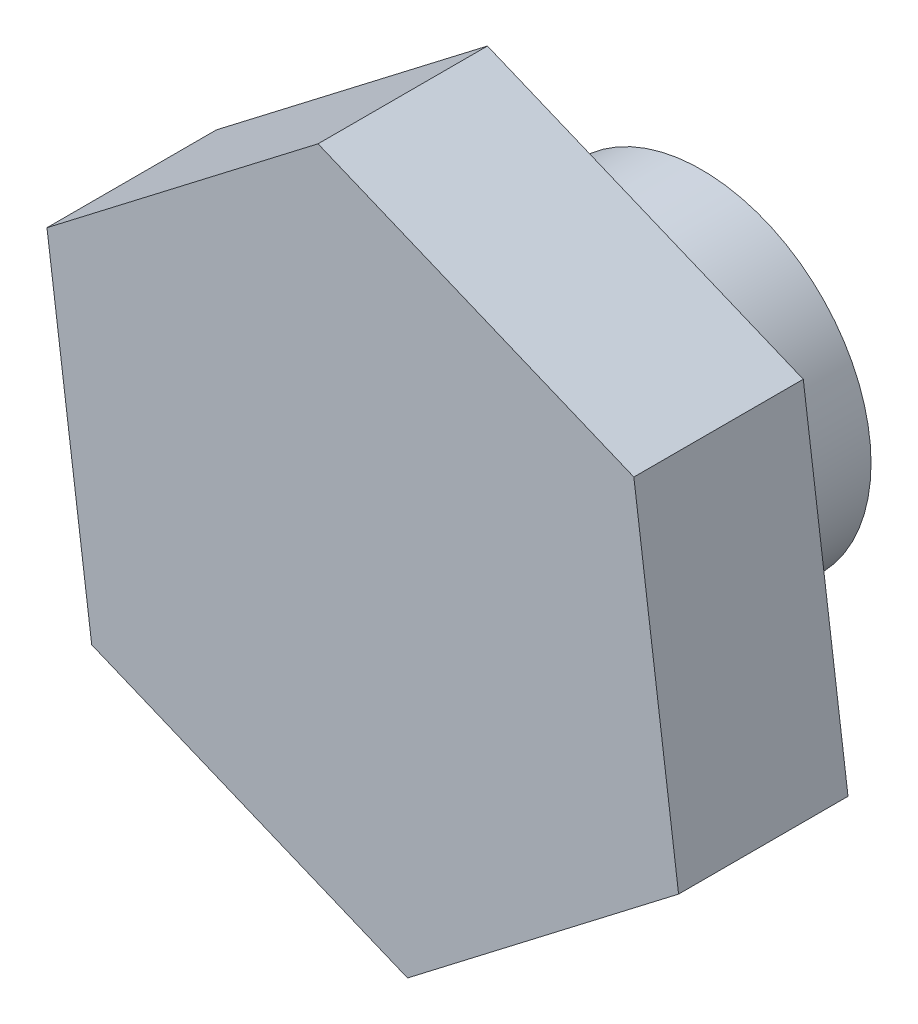
ISO-10303-21;
HEADER;
FILE_DESCRIPTION(('STEP AP214'),'2;1');
FILE_NAME('part.step','',(''),(''),'','','');
FILE_SCHEMA(('AUTOMOTIVE_DESIGN { 1 0 10303 214 1 1 1 1 }'));
ENDSEC;
DATA;
#1=APPLICATION_CONTEXT('core data for automotive mechanical design processes');
#2=APPLICATION_PROTOCOL_DEFINITION('international standard','automotive_design',2000,#1);
#3=PRODUCT_CONTEXT('',#1,'mechanical');
#4=PRODUCT('Part','Part','',(#3));
#5=PRODUCT_RELATED_PRODUCT_CATEGORY('part','',(#4));
#6=PRODUCT_DEFINITION_FORMATION('','',#4);
#7=PRODUCT_DEFINITION_CONTEXT('part definition',#1,'design');
#8=PRODUCT_DEFINITION('design','',#6,#7);
#9=PRODUCT_DEFINITION_SHAPE('','',#8);
#10=(LENGTH_UNIT() NAMED_UNIT(*) SI_UNIT(.MILLI.,.METRE.));
#11=(NAMED_UNIT(*) PLANE_ANGLE_UNIT() SI_UNIT($,.RADIAN.));
#12=(NAMED_UNIT(*) SI_UNIT($,.STERADIAN.) SOLID_ANGLE_UNIT());
#13=UNCERTAINTY_MEASURE_WITH_UNIT(LENGTH_MEASURE(1.E-05),#10,'distance_accuracy_value','');
#14=(GEOMETRIC_REPRESENTATION_CONTEXT(3) GLOBAL_UNCERTAINTY_ASSIGNED_CONTEXT((#13)) GLOBAL_UNIT_ASSIGNED_CONTEXT((#10,
#11,#12)) REPRESENTATION_CONTEXT('',''));
#15=CARTESIAN_POINT('',(0.,0.,0.));
#16=DIRECTION('',(0.,0.,1.));
#17=DIRECTION('',(1.,0.,0.));
#18=AXIS2_PLACEMENT_3D('',#15,#16,#17);
#19=CARTESIAN_POINT('',(-6.60254037844389,50.,25.));
#20=DIRECTION('',(0.609071983146348,-0.793114947120639,0.));
#21=DIRECTION('',(0.793114947120639,0.609071983146348,0.));
#22=AXIS2_PLACEMENT_3D('',#19,#20,#21);
#23=PLANE('',#22);
#24=DIRECTION('',(-0.793114947120639,-0.609071983146348,0.));
#25=VECTOR('',#24,1.);
#26=CARTESIAN_POINT('',(-6.60254037844389,50.,0.));
#27=LINE('',#26,#25);
#28=CARTESIAN_POINT('',(-6.60254037844389,50.,0.));
#29=VERTEX_POINT('',#28);
#30=CARTESIAN_POINT('',(-46.6025403784439,19.2820323027551,0.));
#31=VERTEX_POINT('',#30);
#32=EDGE_CURVE('E124',#29,#31,#27,.T.);
#33=ORIENTED_EDGE('',*,*,#32,.T.);
#34=DIRECTION('',(0.,0.,-1.));
#35=VECTOR('',#34,1.);
#36=CARTESIAN_POINT('',(-46.6025403784439,19.2820323027551,25.));
#37=LINE('',#36,#35);
#38=CARTESIAN_POINT('',(-46.6025403784439,19.2820323027551,25.));
#39=VERTEX_POINT('',#38);
#40=EDGE_CURVE('E47',#39,#31,#37,.T.);
#41=ORIENTED_EDGE('',*,*,#40,.F.);
#42=DIRECTION('',(-0.793114947120639,-0.609071983146348,0.));
#43=VECTOR('',#42,1.);
#44=CARTESIAN_POINT('',(-6.60254037844389,50.,25.));
#45=LINE('',#44,#43);
#46=CARTESIAN_POINT('',(-6.60254037844389,50.,25.));
#47=VERTEX_POINT('',#46);
#48=EDGE_CURVE('E135',#47,#39,#45,.T.);
#49=ORIENTED_EDGE('',*,*,#48,.F.);
#50=DIRECTION('',(0.,0.,-1.));
#51=VECTOR('',#50,1.);
#52=CARTESIAN_POINT('',(-6.60254037844389,50.,25.));
#53=LINE('',#52,#51);
#54=EDGE_CURVE('E120',#47,#29,#53,.T.);
#55=ORIENTED_EDGE('',*,*,#54,.T.);
#56=EDGE_LOOP('',(#33,#41,#49,#55));
#57=FACE_BOUND('',#56,.T.);
#58=ADVANCED_FACE('F39',(#57),#23,.F.);
#59=CARTESIAN_POINT('',(-46.6025403784439,19.2820323027551,25.));
#60=DIRECTION('',(0.9913936839008,0.130914336577785,0.));
#61=DIRECTION('',(-0.130914336577785,0.9913936839008,0.));
#62=AXIS2_PLACEMENT_3D('',#59,#60,#61);
#63=PLANE('',#62);
#64=DIRECTION('',(0.130914336577785,-0.9913936839008,0.));
#65=VECTOR('',#64,1.);
#66=CARTESIAN_POINT('',(-46.6025403784439,19.2820323027551,0.));
#67=LINE('',#66,#65);
#68=CARTESIAN_POINT('',(-40.,-30.7179676972449,0.));
#69=VERTEX_POINT('',#68);
#70=EDGE_CURVE('E127',#31,#69,#67,.T.);
#71=ORIENTED_EDGE('',*,*,#70,.T.);
#72=DIRECTION('',(0.,0.,-1.));
#73=VECTOR('',#72,1.);
#74=CARTESIAN_POINT('',(-40.,-30.7179676972449,25.));
#75=LINE('',#74,#73);
#76=CARTESIAN_POINT('',(-40.,-30.7179676972449,25.));
#77=VERTEX_POINT('',#76);
#78=EDGE_CURVE('E139',#77,#69,#75,.T.);
#79=ORIENTED_EDGE('',*,*,#78,.F.);
#80=DIRECTION('',(0.130914336577785,-0.9913936839008,0.));
#81=VECTOR('',#80,1.);
#82=CARTESIAN_POINT('',(-46.6025403784439,19.2820323027551,25.));
#83=LINE('',#82,#81);
#84=EDGE_CURVE('E93',#39,#77,#83,.T.);
#85=ORIENTED_EDGE('',*,*,#84,.F.);
#86=ORIENTED_EDGE('',*,*,#40,.T.);
#87=EDGE_LOOP('',(#71,#79,#85,#86));
#88=FACE_BOUND('',#87,.T.);
#89=ADVANCED_FACE('F142',(#88),#63,.F.);
#90=CARTESIAN_POINT('',(-40.,-30.7179676972449,25.));
#91=DIRECTION('',(0.382321700754451,0.924029283698425,0.));
#92=DIRECTION('',(-0.924029283698425,0.382321700754451,0.));
#93=AXIS2_PLACEMENT_3D('',#90,#91,#92);
#94=PLANE('',#93);
#95=DIRECTION('',(0.924029283698425,-0.382321700754451,0.));
#96=VECTOR('',#95,1.);
#97=CARTESIAN_POINT('',(-40.,-30.7179676972449,0.));
#98=LINE('',#97,#96);
#99=CARTESIAN_POINT('',(6.60254037844388,-50.,0.));
#100=VERTEX_POINT('',#99);
#101=EDGE_CURVE('E130',#69,#100,#98,.T.);
#102=ORIENTED_EDGE('',*,*,#101,.T.);
#103=DIRECTION('',(0.,0.,-1.));
#104=VECTOR('',#103,1.);
#105=CARTESIAN_POINT('',(6.60254037844388,-50.,25.));
#106=LINE('',#105,#104);
#107=CARTESIAN_POINT('',(6.60254037844388,-50.,25.));
#108=VERTEX_POINT('',#107);
#109=EDGE_CURVE('E115',#108,#100,#106,.T.);
#110=ORIENTED_EDGE('',*,*,#109,.F.);
#111=DIRECTION('',(0.924029283698425,-0.382321700754451,0.));
#112=VECTOR('',#111,1.);
#113=CARTESIAN_POINT('',(-40.,-30.7179676972449,25.));
#114=LINE('',#113,#112);
#115=EDGE_CURVE('E106',#77,#108,#114,.T.);
#116=ORIENTED_EDGE('',*,*,#115,.F.);
#117=ORIENTED_EDGE('',*,*,#78,.T.);
#118=EDGE_LOOP('',(#102,#110,#116,#117));
#119=FACE_BOUND('',#118,.T.);
#120=ADVANCED_FACE('F150',(#119),#94,.F.);
#121=CARTESIAN_POINT('',(6.60254037844388,-50.,25.));
#122=DIRECTION('',(-0.609071983146348,0.793114947120639,0.));
#123=DIRECTION('',(-0.79311494712064,-0.609071983146348,0.));
#124=AXIS2_PLACEMENT_3D('',#121,#122,#123);
#125=PLANE('',#124);
#126=DIRECTION('',(0.793114947120639,0.609071983146348,0.));
#127=VECTOR('',#126,1.);
#128=CARTESIAN_POINT('',(6.60254037844388,-50.,0.));
#129=LINE('',#128,#127);
#130=CARTESIAN_POINT('',(46.6025403784439,-19.2820323027551,0.));
#131=VERTEX_POINT('',#130);
#132=EDGE_CURVE('E114',#100,#131,#129,.T.);
#133=ORIENTED_EDGE('',*,*,#132,.T.);
#134=DIRECTION('',(0.,0.,-1.));
#135=VECTOR('',#134,1.);
#136=CARTESIAN_POINT('',(46.6025403784439,-19.2820323027551,25.));
#137=LINE('',#136,#135);
#138=CARTESIAN_POINT('',(46.6025403784439,-19.2820323027551,25.));
#139=VERTEX_POINT('',#138);
#140=EDGE_CURVE('E111',#139,#131,#137,.T.);
#141=ORIENTED_EDGE('',*,*,#140,.F.);
#142=DIRECTION('',(0.793114947120639,0.609071983146348,0.));
#143=VECTOR('',#142,1.);
#144=CARTESIAN_POINT('',(6.60254037844388,-50.,25.));
#145=LINE('',#144,#143);
#146=EDGE_CURVE('E100',#108,#139,#145,.T.);
#147=ORIENTED_EDGE('',*,*,#146,.F.);
#148=ORIENTED_EDGE('',*,*,#109,.T.);
#149=EDGE_LOOP('',(#133,#141,#147,#148));
#150=FACE_BOUND('',#149,.T.);
#151=ADVANCED_FACE('F112',(#150),#125,.F.);
#152=CARTESIAN_POINT('',(46.6025403784439,-19.2820323027551,25.));
#153=DIRECTION('',(-0.9913936839008,-0.130914336577785,0.));
#154=DIRECTION('',(0.130914336577785,-0.9913936839008,0.));
#155=AXIS2_PLACEMENT_3D('',#152,#153,#154);
#156=PLANE('',#155);
#157=DIRECTION('',(-0.130914336577785,0.9913936839008,0.));
#158=VECTOR('',#157,1.);
#159=CARTESIAN_POINT('',(46.6025403784439,-19.2820323027551,0.));
#160=LINE('',#159,#158);
#161=CARTESIAN_POINT('',(40.,30.7179676972449,0.));
#162=VERTEX_POINT('',#161);
#163=EDGE_CURVE('E78',#131,#162,#160,.T.);
#164=ORIENTED_EDGE('',*,*,#163,.T.);
#165=DIRECTION('',(0.,0.,-1.));
#166=VECTOR('',#165,1.);
#167=CARTESIAN_POINT('',(40.,30.7179676972449,25.));
#168=LINE('',#167,#166);
#169=CARTESIAN_POINT('',(40.,30.7179676972449,25.));
#170=VERTEX_POINT('',#169);
#171=EDGE_CURVE('E116',#170,#162,#168,.T.);
#172=ORIENTED_EDGE('',*,*,#171,.F.);
#173=DIRECTION('',(-0.130914336577785,0.9913936839008,0.));
#174=VECTOR('',#173,1.);
#175=CARTESIAN_POINT('',(46.6025403784439,-19.2820323027551,25.));
#176=LINE('',#175,#174);
#177=EDGE_CURVE('E104',#139,#170,#176,.T.);
#178=ORIENTED_EDGE('',*,*,#177,.F.);
#179=ORIENTED_EDGE('',*,*,#140,.T.);
#180=EDGE_LOOP('',(#164,#172,#178,#179));
#181=FACE_BOUND('',#180,.T.);
#182=ADVANCED_FACE('F118',(#181),#156,.F.);
#183=CARTESIAN_POINT('',(40.,30.7179676972449,25.));
#184=DIRECTION('',(-0.382321700754452,-0.924029283698425,0.));
#185=DIRECTION('',(0.924029283698425,-0.382321700754452,0.));
#186=AXIS2_PLACEMENT_3D('',#183,#184,#185);
#187=PLANE('',#186);
#188=DIRECTION('',(-0.924029283698425,0.382321700754451,0.));
#189=VECTOR('',#188,1.);
#190=CARTESIAN_POINT('',(40.,30.7179676972449,0.));
#191=LINE('',#190,#189);
#192=EDGE_CURVE('E84',#162,#29,#191,.T.);
#193=ORIENTED_EDGE('',*,*,#192,.T.);
#194=ORIENTED_EDGE('',*,*,#54,.F.);
#195=DIRECTION('',(-0.924029283698425,0.382321700754451,0.));
#196=VECTOR('',#195,1.);
#197=CARTESIAN_POINT('',(40.,30.7179676972449,25.));
#198=LINE('',#197,#196);
#199=EDGE_CURVE('E55',#170,#47,#198,.T.);
#200=ORIENTED_EDGE('',*,*,#199,.F.);
#201=ORIENTED_EDGE('',*,*,#171,.T.);
#202=EDGE_LOOP('',(#193,#194,#200,#201));
#203=FACE_BOUND('',#202,.T.);
#204=ADVANCED_FACE('F194',(#203),#187,.F.);
#205=CARTESIAN_POINT('',(0.,0.,25.));
#206=DIRECTION('',(0.,0.,1.));
#207=DIRECTION('',(1.,0.,0.));
#208=AXIS2_PLACEMENT_3D('',#205,#206,#207);
#209=PLANE('',#208);
#210=ORIENTED_EDGE('',*,*,#48,.T.);
#211=ORIENTED_EDGE('',*,*,#84,.T.);
#212=ORIENTED_EDGE('',*,*,#115,.T.);
#213=ORIENTED_EDGE('',*,*,#146,.T.);
#214=ORIENTED_EDGE('',*,*,#177,.T.);
#215=ORIENTED_EDGE('',*,*,#199,.T.);
#216=EDGE_LOOP('',(#210,#211,#212,#213,#214,#215));
#217=FACE_BOUND('',#216,.T.);
#218=ADVANCED_FACE('F102',(#217),#209,.T.);
#219=CARTESIAN_POINT('',(0.,0.,0.));
#220=DIRECTION('',(0.,0.,1.));
#221=DIRECTION('',(1.,0.,0.));
#222=AXIS2_PLACEMENT_3D('',#219,#220,#221);
#223=PLANE('',#222);
#224=CARTESIAN_POINT('',(0.,0.,0.));
#225=DIRECTION('',(0.,0.,1.));
#226=DIRECTION('',(1.,0.,0.));
#227=AXIS2_PLACEMENT_3D('',#224,#225,#226);
#228=CIRCLE('',#227,25.);
#229=CARTESIAN_POINT('',(25.,0.,0.));
#230=VERTEX_POINT('',#229);
#231=EDGE_CURVE('E154',#230,#230,#228,.T.);
#232=ORIENTED_EDGE('',*,*,#231,.T.);
#233=EDGE_LOOP('',(#232));
#234=FACE_BOUND('',#233,.T.);
#235=ORIENTED_EDGE('',*,*,#32,.F.);
#236=ORIENTED_EDGE('',*,*,#192,.F.);
#237=ORIENTED_EDGE('',*,*,#163,.F.);
#238=ORIENTED_EDGE('',*,*,#132,.F.);
#239=ORIENTED_EDGE('',*,*,#101,.F.);
#240=ORIENTED_EDGE('',*,*,#70,.F.);
#241=EDGE_LOOP('',(#235,#236,#237,#238,#239,#240));
#242=FACE_BOUND('',#241,.T.);
#243=ADVANCED_FACE('F147',(#234,#242),#223,.F.);
#244=CARTESIAN_POINT('',(0.,0.,-25.));
#245=DIRECTION('',(0.,0.,1.));
#246=DIRECTION('',(1.,0.,0.));
#247=AXIS2_PLACEMENT_3D('',#244,#245,#246);
#248=CYLINDRICAL_SURFACE('',#247,25.);
#249=CARTESIAN_POINT('',(0.,0.,-25.));
#250=DIRECTION('',(0.,0.,1.));
#251=DIRECTION('',(1.,0.,0.));
#252=AXIS2_PLACEMENT_3D('',#249,#250,#251);
#253=CIRCLE('',#252,25.);
#254=CARTESIAN_POINT('',(25.,0.,-25.));
#255=VERTEX_POINT('',#254);
#256=EDGE_CURVE('E128',#255,#255,#253,.T.);
#257=ORIENTED_EDGE('',*,*,#256,.T.);
#258=EDGE_LOOP('',(#257));
#259=FACE_BOUND('',#258,.T.);
#260=ORIENTED_EDGE('',*,*,#231,.F.);
#261=EDGE_LOOP('',(#260));
#262=FACE_BOUND('',#261,.T.);
#263=ADVANCED_FACE('F180',(#259,#262),#248,.T.);
#264=CARTESIAN_POINT('',(0.,0.,-25.));
#265=DIRECTION('',(0.,0.,1.));
#266=DIRECTION('',(1.,0.,0.));
#267=AXIS2_PLACEMENT_3D('',#264,#265,#266);
#268=PLANE('',#267);
#269=CARTESIAN_POINT('',(0.,0.,-25.));
#270=DIRECTION('',(0.,0.,1.));
#271=DIRECTION('',(1.,0.,0.));
#272=AXIS2_PLACEMENT_3D('',#269,#270,#271);
#273=CIRCLE('',#272,12.5);
#274=CARTESIAN_POINT('',(12.5,0.,-25.));
#275=VERTEX_POINT('',#274);
#276=EDGE_CURVE('E157',#275,#275,#273,.T.);
#277=ORIENTED_EDGE('',*,*,#276,.T.);
#278=EDGE_LOOP('',(#277));
#279=FACE_BOUND('',#278,.T.);
#280=ORIENTED_EDGE('',*,*,#256,.F.);
#281=EDGE_LOOP('',(#280));
#282=FACE_BOUND('',#281,.T.);
#283=ADVANCED_FACE('F163',(#279,#282),#268,.F.);
#284=CARTESIAN_POINT('',(0.,0.,-25.));
#285=DIRECTION('',(0.,0.,1.));
#286=DIRECTION('',(1.,0.,0.));
#287=AXIS2_PLACEMENT_3D('',#284,#285,#286);
#288=CYLINDRICAL_SURFACE('',#287,12.5);
#289=ORIENTED_EDGE('',*,*,#276,.F.);
#290=EDGE_LOOP('',(#289));
#291=FACE_BOUND('',#290,.T.);
#292=CARTESIAN_POINT('',(0.,0.,0.));
#293=DIRECTION('',(0.,0.,1.));
#294=DIRECTION('',(1.,0.,0.));
#295=AXIS2_PLACEMENT_3D('',#292,#293,#294);
#296=CIRCLE('',#295,12.5);
#297=CARTESIAN_POINT('',(12.5,0.,0.));
#298=VERTEX_POINT('',#297);
#299=EDGE_CURVE('E11',#298,#298,#296,.T.);
#300=ORIENTED_EDGE('',*,*,#299,.T.);
#301=EDGE_LOOP('',(#300));
#302=FACE_BOUND('',#301,.T.);
#303=ADVANCED_FACE('F166',(#291,#302),#288,.F.);
#304=ORIENTED_EDGE('',*,*,#299,.F.);
#305=EDGE_LOOP('',(#304));
#306=FACE_BOUND('',#305,.T.);
#307=ADVANCED_FACE('F169',(#306),#223,.F.);
#308=CLOSED_SHELL('',(#58,#89,#120,#151,#182,#204,#218,#243,#263,#283,#303,#307));
#309=MANIFOLD_SOLID_BREP('B2',#308);
#310=ADVANCED_BREP_SHAPE_REPRESENTATION('',(#18,#309),#14);
#311=SHAPE_DEFINITION_REPRESENTATION(#9,#310);
ENDSEC;
END-ISO-10303-21;
